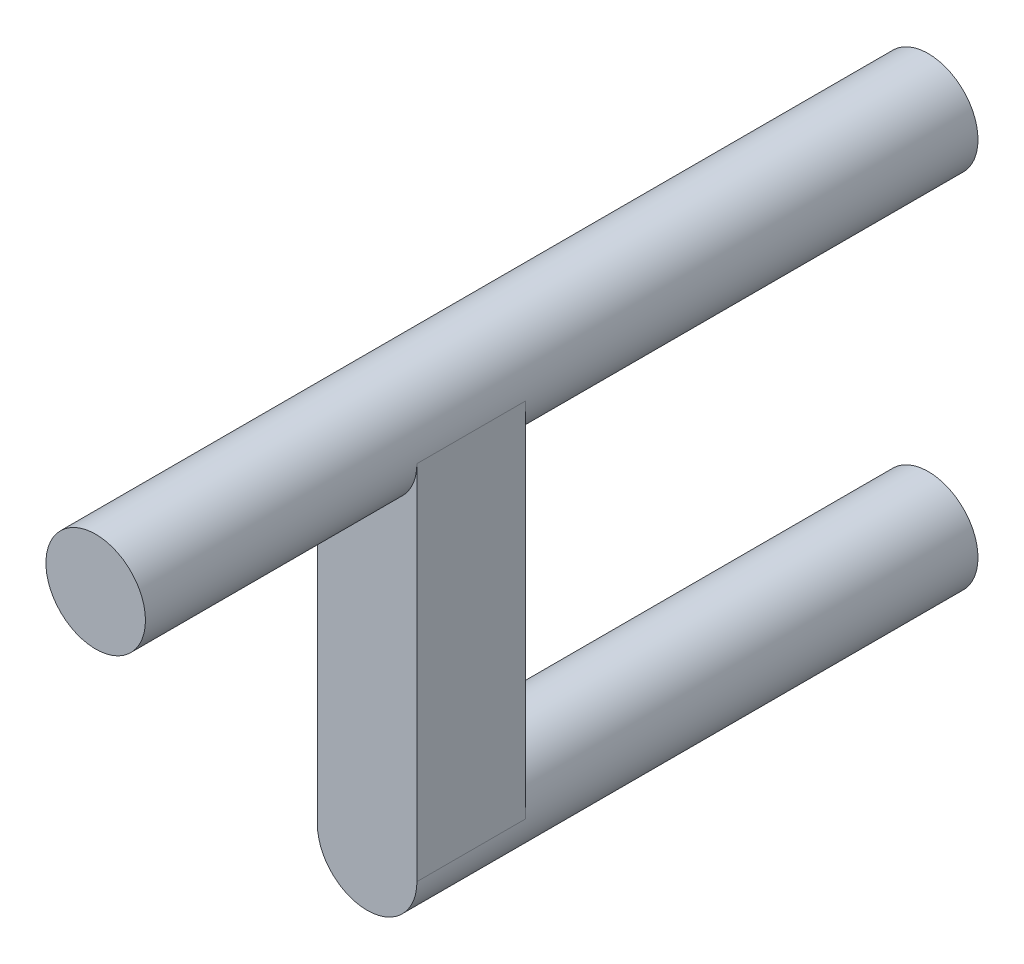
ISO-10303-21;
HEADER;
FILE_DESCRIPTION(('STEP AP214'),'2;1');
FILE_NAME('part.step','',(''),(''),'','','');
FILE_SCHEMA(('AUTOMOTIVE_DESIGN { 1 0 10303 214 1 1 1 1 }'));
ENDSEC;
DATA;
#1=APPLICATION_CONTEXT('core data for automotive mechanical design processes');
#2=APPLICATION_PROTOCOL_DEFINITION('international standard','automotive_design',2000,#1);
#3=PRODUCT_CONTEXT('',#1,'mechanical');
#4=PRODUCT('Part','Part','',(#3));
#5=PRODUCT_RELATED_PRODUCT_CATEGORY('part','',(#4));
#6=PRODUCT_DEFINITION_FORMATION('','',#4);
#7=PRODUCT_DEFINITION_CONTEXT('part definition',#1,'design');
#8=PRODUCT_DEFINITION('design','',#6,#7);
#9=PRODUCT_DEFINITION_SHAPE('','',#8);
#10=(LENGTH_UNIT() NAMED_UNIT(*) SI_UNIT(.MILLI.,.METRE.));
#11=(NAMED_UNIT(*) PLANE_ANGLE_UNIT() SI_UNIT($,.RADIAN.));
#12=(NAMED_UNIT(*) SI_UNIT($,.STERADIAN.) SOLID_ANGLE_UNIT());
#13=UNCERTAINTY_MEASURE_WITH_UNIT(LENGTH_MEASURE(1.E-05),#10,'distance_accuracy_value','');
#14=(GEOMETRIC_REPRESENTATION_CONTEXT(3) GLOBAL_UNCERTAINTY_ASSIGNED_CONTEXT((#13)) GLOBAL_UNIT_ASSIGNED_CONTEXT((#10,
#11,#12)) REPRESENTATION_CONTEXT('',''));
#15=CARTESIAN_POINT('',(0.,0.,0.));
#16=DIRECTION('',(0.,0.,1.));
#17=DIRECTION('',(1.,0.,0.));
#18=AXIS2_PLACEMENT_3D('',#15,#16,#17);
#19=CARTESIAN_POINT('',(0.,0.,116.84));
#20=DIRECTION('',(0.,0.,-1.));
#21=DIRECTION('',(-1.,0.,0.));
#22=AXIS2_PLACEMENT_3D('',#19,#20,#21);
#23=CYLINDRICAL_SURFACE('',#22,6.985);
#24=CARTESIAN_POINT('',(0.,0.,0.));
#25=DIRECTION('',(0.,0.,1.));
#26=DIRECTION('',(1.,0.,0.));
#27=AXIS2_PLACEMENT_3D('',#24,#25,#26);
#28=CIRCLE('',#27,6.985);
#29=CARTESIAN_POINT('',(6.985,0.,0.));
#30=VERTEX_POINT('',#29);
#31=EDGE_CURVE('E129',#30,#30,#28,.T.);
#32=ORIENTED_EDGE('',*,*,#31,.T.);
#33=EDGE_LOOP('',(#32));
#34=FACE_BOUND('',#33,.T.);
#35=CARTESIAN_POINT('',(0.,0.,116.84));
#36=DIRECTION('',(0.,0.,1.));
#37=DIRECTION('',(1.,0.,0.));
#38=AXIS2_PLACEMENT_3D('',#35,#36,#37);
#39=CIRCLE('',#38,6.985);
#40=CARTESIAN_POINT('',(6.985,0.,116.84));
#41=VERTEX_POINT('',#40);
#42=EDGE_CURVE('E130',#41,#41,#39,.T.);
#43=ORIENTED_EDGE('',*,*,#42,.F.);
#44=EDGE_LOOP('',(#43));
#45=FACE_BOUND('',#44,.T.);
#46=CARTESIAN_POINT('',(0.,0.,78.74));
#47=DIRECTION('',(0.,0.,-1.));
#48=DIRECTION('',(-1.,0.,0.));
#49=AXIS2_PLACEMENT_3D('',#46,#47,#48);
#50=CIRCLE('',#49,6.985);
#51=CARTESIAN_POINT('',(6.985,0.,78.74));
#52=VERTEX_POINT('',#51);
#53=CARTESIAN_POINT('',(-6.985,0.,78.74));
#54=VERTEX_POINT('',#53);
#55=EDGE_CURVE('E11',#52,#54,#50,.T.);
#56=ORIENTED_EDGE('',*,*,#55,.F.);
#57=DIRECTION('',(0.,0.,-1.));
#58=VECTOR('',#57,1.);
#59=CARTESIAN_POINT('',(6.985,0.,78.74));
#60=LINE('',#59,#58);
#61=CARTESIAN_POINT('',(6.985,0.,63.5));
#62=VERTEX_POINT('',#61);
#63=EDGE_CURVE('E102',#52,#62,#60,.T.);
#64=ORIENTED_EDGE('',*,*,#63,.T.);
#65=CARTESIAN_POINT('',(0.,0.,63.5));
#66=DIRECTION('',(0.,0.,-1.));
#67=DIRECTION('',(-1.,0.,0.));
#68=AXIS2_PLACEMENT_3D('',#65,#66,#67);
#69=CIRCLE('',#68,6.985);
#70=CARTESIAN_POINT('',(-6.985,0.,63.5));
#71=VERTEX_POINT('',#70);
#72=EDGE_CURVE('E49',#62,#71,#69,.T.);
#73=ORIENTED_EDGE('',*,*,#72,.T.);
#74=DIRECTION('',(0.,0.,-1.));
#75=VECTOR('',#74,1.);
#76=CARTESIAN_POINT('',(-6.985,0.,78.74));
#77=LINE('',#76,#75);
#78=EDGE_CURVE('E56',#54,#71,#77,.T.);
#79=ORIENTED_EDGE('',*,*,#78,.F.);
#80=EDGE_LOOP('',(#56,#64,#73,#79));
#81=FACE_BOUND('',#80,.T.);
#82=ADVANCED_FACE('F41',(#34,#45,#81),#23,.T.);
#83=CARTESIAN_POINT('',(0.,0.,116.84));
#84=DIRECTION('',(0.,0.,1.));
#85=DIRECTION('',(1.,0.,0.));
#86=AXIS2_PLACEMENT_3D('',#83,#84,#85);
#87=PLANE('',#86);
#88=ORIENTED_EDGE('',*,*,#42,.T.);
#89=EDGE_LOOP('',(#88));
#90=FACE_BOUND('',#89,.T.);
#91=ADVANCED_FACE('F139',(#90),#87,.T.);
#92=CARTESIAN_POINT('',(0.,0.,0.));
#93=DIRECTION('',(0.,0.,1.));
#94=DIRECTION('',(1.,0.,0.));
#95=AXIS2_PLACEMENT_3D('',#92,#93,#94);
#96=PLANE('',#95);
#97=ORIENTED_EDGE('',*,*,#31,.F.);
#98=EDGE_LOOP('',(#97));
#99=FACE_BOUND('',#98,.T.);
#100=ADVANCED_FACE('F144',(#99),#96,.F.);
#101=CARTESIAN_POINT('',(-6.985,0.,78.74));
#102=DIRECTION('',(1.,0.,0.));
#103=DIRECTION('',(0.,1.,0.));
#104=AXIS2_PLACEMENT_3D('',#101,#102,#103);
#105=PLANE('',#104);
#106=DIRECTION('',(0.,-1.,0.));
#107=VECTOR('',#106,1.);
#108=CARTESIAN_POINT('',(-6.985,0.,63.5));
#109=LINE('',#108,#107);
#110=CARTESIAN_POINT('',(-6.985,-50.8,63.5));
#111=VERTEX_POINT('',#110);
#112=EDGE_CURVE('E93',#71,#111,#109,.T.);
#113=ORIENTED_EDGE('',*,*,#112,.T.);
#114=DIRECTION('',(0.,0.,-1.));
#115=VECTOR('',#114,1.);
#116=CARTESIAN_POINT('',(-6.985,-50.8,78.74));
#117=LINE('',#116,#115);
#118=CARTESIAN_POINT('',(-6.985,-50.8,78.74));
#119=VERTEX_POINT('',#118);
#120=EDGE_CURVE('E101',#119,#111,#117,.T.);
#121=ORIENTED_EDGE('',*,*,#120,.F.);
#122=DIRECTION('',(0.,-1.,0.));
#123=VECTOR('',#122,1.);
#124=CARTESIAN_POINT('',(-6.985,0.,78.74));
#125=LINE('',#124,#123);
#126=EDGE_CURVE('E92',#54,#119,#125,.T.);
#127=ORIENTED_EDGE('',*,*,#126,.F.);
#128=ORIENTED_EDGE('',*,*,#78,.T.);
#129=EDGE_LOOP('',(#113,#121,#127,#128));
#130=FACE_BOUND('',#129,.T.);
#131=ADVANCED_FACE('F152',(#130),#105,.F.);
#132=CARTESIAN_POINT('',(6.985,0.,78.74));
#133=DIRECTION('',(-1.,0.,0.));
#134=DIRECTION('',(0.,-1.,0.));
#135=AXIS2_PLACEMENT_3D('',#132,#133,#134);
#136=PLANE('',#135);
#137=DIRECTION('',(0.,1.,0.));
#138=VECTOR('',#137,1.);
#139=CARTESIAN_POINT('',(6.985,0.,63.5));
#140=LINE('',#139,#138);
#141=CARTESIAN_POINT('',(6.98500000000001,-50.8,63.5));
#142=VERTEX_POINT('',#141);
#143=EDGE_CURVE('E84',#142,#62,#140,.T.);
#144=ORIENTED_EDGE('',*,*,#143,.T.);
#145=ORIENTED_EDGE('',*,*,#63,.F.);
#146=DIRECTION('',(0.,1.,0.));
#147=VECTOR('',#146,1.);
#148=CARTESIAN_POINT('',(6.985,0.,78.74));
#149=LINE('',#148,#147);
#150=CARTESIAN_POINT('',(6.985,-50.8,78.74));
#151=VERTEX_POINT('',#150);
#152=EDGE_CURVE('E64',#151,#52,#149,.T.);
#153=ORIENTED_EDGE('',*,*,#152,.F.);
#154=DIRECTION('',(0.,0.,-1.));
#155=VECTOR('',#154,1.);
#156=CARTESIAN_POINT('',(6.985,-50.8,78.74));
#157=LINE('',#156,#155);
#158=EDGE_CURVE('E96',#151,#142,#157,.T.);
#159=ORIENTED_EDGE('',*,*,#158,.T.);
#160=EDGE_LOOP('',(#144,#145,#153,#159));
#161=FACE_BOUND('',#160,.T.);
#162=ADVANCED_FACE('F97',(#161),#136,.F.);
#163=CARTESIAN_POINT('',(0.,0.,78.74));
#164=DIRECTION('',(0.,0.,-1.));
#165=DIRECTION('',(-1.,0.,0.));
#166=AXIS2_PLACEMENT_3D('',#163,#164,#165);
#167=PLANE('',#166);
#168=ORIENTED_EDGE('',*,*,#126,.T.);
#169=CARTESIAN_POINT('',(0.,-50.8,78.74));
#170=DIRECTION('',(0.,0.,1.));
#171=DIRECTION('',(1.,0.,0.));
#172=AXIS2_PLACEMENT_3D('',#169,#170,#171);
#173=CIRCLE('',#172,6.985);
#174=EDGE_CURVE('E115',#119,#151,#173,.T.);
#175=ORIENTED_EDGE('',*,*,#174,.T.);
#176=ORIENTED_EDGE('',*,*,#152,.T.);
#177=ORIENTED_EDGE('',*,*,#55,.T.);
#178=EDGE_LOOP('',(#168,#175,#176,#177));
#179=FACE_BOUND('',#178,.T.);
#180=ADVANCED_FACE('F160',(#179),#167,.F.);
#181=CARTESIAN_POINT('',(0.,0.,63.5));
#182=DIRECTION('',(0.,0.,-1.));
#183=DIRECTION('',(-1.,0.,0.));
#184=AXIS2_PLACEMENT_3D('',#181,#182,#183);
#185=PLANE('',#184);
#186=ORIENTED_EDGE('',*,*,#143,.F.);
#187=CARTESIAN_POINT('',(0.,-50.8,63.5));
#188=DIRECTION('',(0.,0.,1.));
#189=DIRECTION('',(1.,0.,0.));
#190=AXIS2_PLACEMENT_3D('',#187,#188,#189);
#191=CIRCLE('',#190,6.985);
#192=EDGE_CURVE('E88',#142,#111,#191,.T.);
#193=ORIENTED_EDGE('',*,*,#192,.T.);
#194=ORIENTED_EDGE('',*,*,#112,.F.);
#195=ORIENTED_EDGE('',*,*,#72,.F.);
#196=EDGE_LOOP('',(#186,#193,#194,#195));
#197=FACE_BOUND('',#196,.T.);
#198=ADVANCED_FACE('F86',(#197),#185,.T.);
#199=CARTESIAN_POINT('',(0.,-50.8,63.5));
#200=DIRECTION('',(0.,0.,-1.));
#201=DIRECTION('',(-1.,0.,0.));
#202=AXIS2_PLACEMENT_3D('',#199,#200,#201);
#203=CYLINDRICAL_SURFACE('',#202,6.985);
#204=ORIENTED_EDGE('',*,*,#192,.F.);
#205=ORIENTED_EDGE('',*,*,#158,.F.);
#206=ORIENTED_EDGE('',*,*,#174,.F.);
#207=ORIENTED_EDGE('',*,*,#120,.T.);
#208=EDGE_LOOP('',(#204,#205,#206,#207));
#209=FACE_BOUND('',#208,.T.);
#210=CARTESIAN_POINT('',(0.,-50.8,0.));
#211=DIRECTION('',(0.,0.,1.));
#212=DIRECTION('',(1.,0.,0.));
#213=AXIS2_PLACEMENT_3D('',#210,#211,#212);
#214=CIRCLE('',#213,6.985);
#215=CARTESIAN_POINT('',(6.98500000000001,-50.8,0.));
#216=VERTEX_POINT('',#215);
#217=EDGE_CURVE('E109',#216,#216,#214,.T.);
#218=ORIENTED_EDGE('',*,*,#217,.T.);
#219=EDGE_LOOP('',(#218));
#220=FACE_BOUND('',#219,.T.);
#221=ADVANCED_FACE('F105',(#209,#220),#203,.T.);
#222=CARTESIAN_POINT('',(0.,0.,0.));
#223=DIRECTION('',(0.,0.,1.));
#224=DIRECTION('',(1.,0.,0.));
#225=AXIS2_PLACEMENT_3D('',#222,#223,#224);
#226=PLANE('',#225);
#227=ORIENTED_EDGE('',*,*,#217,.F.);
#228=EDGE_LOOP('',(#227));
#229=FACE_BOUND('',#228,.T.);
#230=ADVANCED_FACE('F167',(#229),#226,.F.);
#231=CLOSED_SHELL('',(#82,#91,#100,#131,#162,#180,#198,#221,#230));
#232=MANIFOLD_SOLID_BREP('B2',#231);
#233=ADVANCED_BREP_SHAPE_REPRESENTATION('',(#18,#232),#14);
#234=SHAPE_DEFINITION_REPRESENTATION(#9,#233);
ENDSEC;
END-ISO-10303-21;
